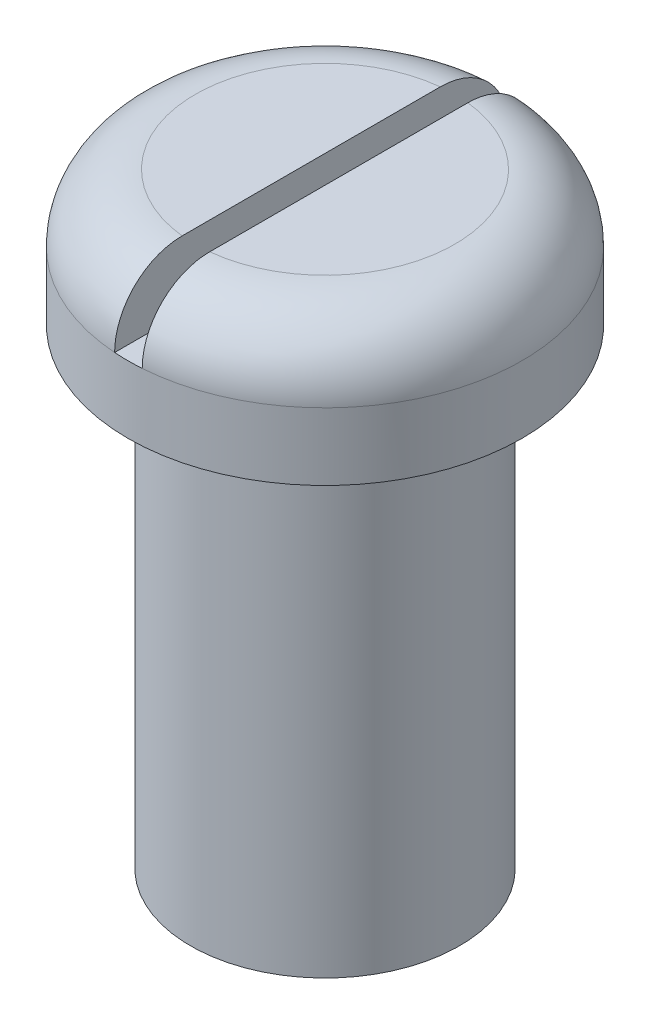
ISO-10303-21;
HEADER;
FILE_DESCRIPTION(('STEP AP214'),'2;1');
FILE_NAME('part.step','',(''),(''),'','','');
FILE_SCHEMA(('AUTOMOTIVE_DESIGN { 1 0 10303 214 1 1 1 1 }'));
ENDSEC;
DATA;
#1=APPLICATION_CONTEXT('core data for automotive mechanical design processes');
#2=APPLICATION_PROTOCOL_DEFINITION('international standard','automotive_design',2000,#1);
#3=PRODUCT_CONTEXT('',#1,'mechanical');
#4=PRODUCT('Part','Part','',(#3));
#5=PRODUCT_RELATED_PRODUCT_CATEGORY('part','',(#4));
#6=PRODUCT_DEFINITION_FORMATION('','',#4);
#7=PRODUCT_DEFINITION_CONTEXT('part definition',#1,'design');
#8=PRODUCT_DEFINITION('design','',#6,#7);
#9=PRODUCT_DEFINITION_SHAPE('','',#8);
#10=(LENGTH_UNIT() NAMED_UNIT(*) SI_UNIT(.MILLI.,.METRE.));
#11=(NAMED_UNIT(*) PLANE_ANGLE_UNIT() SI_UNIT($,.RADIAN.));
#12=(NAMED_UNIT(*) SI_UNIT($,.STERADIAN.) SOLID_ANGLE_UNIT());
#13=UNCERTAINTY_MEASURE_WITH_UNIT(LENGTH_MEASURE(1.E-05),#10,'distance_accuracy_value','');
#14=(GEOMETRIC_REPRESENTATION_CONTEXT(3) GLOBAL_UNCERTAINTY_ASSIGNED_CONTEXT((#13)) GLOBAL_UNIT_ASSIGNED_CONTEXT((#10,
#11,#12)) REPRESENTATION_CONTEXT('',''));
#15=CARTESIAN_POINT('',(0.,0.,0.));
#16=DIRECTION('',(0.,0.,1.));
#17=DIRECTION('',(1.,0.,0.));
#18=AXIS2_PLACEMENT_3D('',#15,#16,#17);
#19=CARTESIAN_POINT('',(0.,9.,0.));
#20=DIRECTION('',(0.,1.,0.));
#21=DIRECTION('',(0.,0.,1.));
#22=AXIS2_PLACEMENT_3D('',#19,#20,#21);
#23=PLANE('',#22);
#24=CARTESIAN_POINT('',(0.,9.,0.));
#25=DIRECTION('',(0.,-1.,0.));
#26=DIRECTION('',(0.,0.,-1.));
#27=AXIS2_PLACEMENT_3D('',#24,#25,#26);
#28=CIRCLE('',#27,1.92999999999999);
#29=CARTESIAN_POINT('',(-0.204999999999999,9.,1.91908181170058));
#30=VERTEX_POINT('',#29);
#31=CARTESIAN_POINT('',(-0.204999999999999,9.,-1.91908181170058));
#32=VERTEX_POINT('',#31);
#33=EDGE_CURVE('E39',#30,#32,#28,.T.);
#34=ORIENTED_EDGE('',*,*,#33,.F.);
#35=DIRECTION('',(0.,0.,-1.));
#36=VECTOR('',#35,1.);
#37=CARTESIAN_POINT('',(-0.205,9.,2.931));
#38=LINE('',#37,#36);
#39=EDGE_CURVE('E78',#30,#32,#38,.T.);
#40=ORIENTED_EDGE('',*,*,#39,.T.);
#41=EDGE_LOOP('',(#34,#40));
#42=FACE_BOUND('',#41,.T.);
#43=ADVANCED_FACE('F32',(#42),#23,.T.);
#44=CARTESIAN_POINT('',(0.205,9.,-1.91908181170058));
#45=VERTEX_POINT('',#44);
#46=CARTESIAN_POINT('',(0.205,9.,1.91908181170059));
#47=VERTEX_POINT('',#46);
#48=EDGE_CURVE('E11',#45,#47,#28,.T.);
#49=ORIENTED_EDGE('',*,*,#48,.F.);
#50=DIRECTION('',(0.,0.,-1.));
#51=VECTOR('',#50,1.);
#52=CARTESIAN_POINT('',(0.205,9.,2.931));
#53=LINE('',#52,#51);
#54=EDGE_CURVE('E71',#47,#45,#53,.T.);
#55=ORIENTED_EDGE('',*,*,#54,.F.);
#56=EDGE_LOOP('',(#49,#55));
#57=FACE_BOUND('',#56,.T.);
#58=ADVANCED_FACE('F87',(#57),#23,.T.);
#59=CARTESIAN_POINT('',(0.,8.,0.));
#60=DIRECTION('',(0.,-1.,0.));
#61=DIRECTION('',(0.,0.,-1.));
#62=AXIS2_PLACEMENT_3D('',#59,#60,#61);
#63=TOROIDAL_SURFACE('',#62,1.93,1.);
#64=ORIENTED_EDGE('',*,*,#33,.T.);
#65=CARTESIAN_POINT('',(-0.20500004878466,8.3634760546069,-2.85425123385193));
#66=CARTESIAN_POINT('',(-0.205000060924762,8.31128318651751,-2.8746646962673));
#67=CARTESIAN_POINT('',(-0.205000016333504,8.25732941608698,-2.89068735806144));
#68=CARTESIAN_POINT('',(-0.204999983647028,8.14745282198192,-2.91345918078132));
#69=CARTESIAN_POINT('',(-0.204999995619211,8.09152772805922,-2.92019726595171));
#70=CARTESIAN_POINT('',(-0.205000004378763,7.97936105584045,-2.92418234732537));
#71=CARTESIAN_POINT('',(-0.205000001173154,7.92311963587223,-2.92143373148673));
#72=CARTESIAN_POINT('',(-0.204999998827135,7.81191227055986,-2.90653250352774));
#73=CARTESIAN_POINT('',(-0.204999999685728,7.75694601500542,-2.89438220380387));
#74=CARTESIAN_POINT('',(-0.20500000031428,7.64983087903669,-2.8610290546288));
#75=CARTESIAN_POINT('',(-0.205000000084215,7.59768206140316,-2.83982600354943));
#76=CARTESIAN_POINT('',(-0.204999999915782,7.49767783227654,-2.78897299019701));
#77=CARTESIAN_POINT('',(-0.204999999977424,7.44982259431253,-2.75932268672232));
#78=CARTESIAN_POINT('',(-0.205000000022598,7.35971506283505,-2.69239090382436));
#79=CARTESIAN_POINT('',(-0.205000000006056,7.31746809567159,-2.65510225427839));
#80=CARTESIAN_POINT('',(-0.204999999993945,7.23981779166026,-2.57397549923543));
#81=CARTESIAN_POINT('',(-0.204999999998376,7.20441449430842,-2.53013735594272));
#82=CARTESIAN_POINT('',(-0.205000000001628,7.14136923430299,-2.43705599031676));
#83=CARTESIAN_POINT('',(-0.205000000000436,7.11374446137745,-2.38780112622582));
#84=CARTESIAN_POINT('',(-0.204999999999564,7.06712297739729,-2.28536544502652));
#85=CARTESIAN_POINT('',(-0.204999999999883,7.04812637452688,-2.23218457870175));
#86=CARTESIAN_POINT('',(-0.205000000000118,7.01922173894556,-2.12320237311493));
#87=CARTESIAN_POINT('',(-0.205000000000032,7.00934680607102,-2.06739225669441));
#88=CARTESIAN_POINT('',(-0.204999999999969,6.99905605766553,-1.9549073373052));
#89=CARTESIAN_POINT('',(-0.204999999999992,6.99864047933218,-1.8982325126892));
#90=CARTESIAN_POINT('',(-0.205000000000009,7.00727434091725,-1.78531782922262));
#91=CARTESIAN_POINT('',(-0.205000000000003,7.01637209590596,-1.72908166630521));
#92=CARTESIAN_POINT('',(-0.204999999999998,7.04382388108062,-1.61891607788622));
#93=CARTESIAN_POINT('',(-0.205,7.06217822900747,-1.56498673163714));
#94=CARTESIAN_POINT('',(-0.205000000000001,7.10774129768165,-1.46063501179173));
#95=CARTESIAN_POINT('',(-0.205,7.13500065613316,-1.41023474490182));
#96=CARTESIAN_POINT('',(-0.205,7.19756919850292,-1.31470339636545));
#97=CARTESIAN_POINT('',(-0.205,7.23287878720181,-1.26957257984942));
#98=CARTESIAN_POINT('',(-0.205,7.31068072616502,-1.18574457428164));
#99=CARTESIAN_POINT('',(-0.205,7.35319388874003,-1.14706669037335));
#100=CARTESIAN_POINT('',(-0.205,7.44415406950189,-1.07745796303861));
#101=CARTESIAN_POINT('',(-0.205,7.49260100047326,-1.04652700576694));
#102=CARTESIAN_POINT('',(-0.205,7.5936771862387,-0.993606139076374));
#103=CARTESIAN_POINT('',(-0.205,7.64627086708744,-0.971548363944125));
#104=CARTESIAN_POINT('',(-0.205,7.75446362392789,-0.936795829626461));
#105=CARTESIAN_POINT('',(-0.205,7.81006212094307,-0.924099273549402));
#106=CARTESIAN_POINT('',(-0.205,7.92141439857798,-0.908709769761603));
#107=CARTESIAN_POINT('',(-0.205,7.97713946523828,-0.905808824480563));
#108=CARTESIAN_POINT('',(-0.205,8.08826709999474,-0.909537083841432));
#109=CARTESIAN_POINT('',(-0.205,8.14366968948705,-0.916165648799566));
#110=CARTESIAN_POINT('',(-0.205,8.25187167456827,-0.938561454803291));
#111=CARTESIAN_POINT('',(-0.205,8.30469481883998,-0.954214449496018));
#112=CARTESIAN_POINT('',(-0.205,8.40702721272639,-0.994033810813302));
#113=CARTESIAN_POINT('',(-0.205000000000001,8.45653614272574,-1.01820099712382));
#114=CARTESIAN_POINT('',(-0.204999999999999,8.55165326705991,-1.07472094379417));
#115=CARTESIAN_POINT('',(-0.204999999999997,8.59719116185209,-1.10719194778067));
#116=CARTESIAN_POINT('',(-0.205000000000003,8.68231246645757,-1.1791744181796));
#117=CARTESIAN_POINT('',(-0.205000000000011,8.72189534975607,-1.21868650645853));
#118=CARTESIAN_POINT('',(-0.204999999999989,8.794801978765,-1.30452098569869));
#119=CARTESIAN_POINT('',(-0.204999999999958,8.82798183001994,-1.3509656886221));
#120=CARTESIAN_POINT('',(-0.205000000000042,8.88613662778988,-1.44873672974725));
#121=CARTESIAN_POINT('',(-0.205000000000157,8.91111119808982,-1.50006329164489));
#122=CARTESIAN_POINT('',(-0.204999999999842,8.95228301844873,-1.60652571950102));
#123=CARTESIAN_POINT('',(-0.204999999999409,8.96841987606833,-1.66168496230215));
#124=CARTESIAN_POINT('',(-0.205000000000591,8.99117135933444,-1.77393449500385));
#125=CARTESIAN_POINT('',(-0.205000000002206,8.99778604295973,-1.83102477314454));
#126=CARTESIAN_POINT('',(-0.204999999997801,9.00126926573594,-1.945318776725));
#127=CARTESIAN_POINT('',(-0.204999999991804,8.99816912511669,-2.00252154462081));
#128=CARTESIAN_POINT('',(-0.205000000008195,8.98235089581664,-2.11557974516592));
#129=CARTESIAN_POINT('',(-0.20500000003058,8.96963345620804,-2.17143526847836));
#130=CARTESIAN_POINT('',(-0.204999999969601,8.93502604303999,-2.27986369655133));
#131=CARTESIAN_POINT('',(-0.204999999886861,8.91319078823627,-2.33245406890842));
#132=CARTESIAN_POINT('',(-0.205000000113164,8.86095046859123,-2.4332093249281));
#133=CARTESIAN_POINT('',(-0.205000000422293,8.83054349765776,-2.48137322111299));
#134=CARTESIAN_POINT('',(-0.204999999579627,8.76218376196397,-2.57165676139258));
#135=CARTESIAN_POINT('',(-0.204999998434468,8.72426592968993,-2.61380288795137));
#136=CARTESIAN_POINT('',(-0.205000001563608,8.64189691479329,-2.6910612138556));
#137=CARTESIAN_POINT('',(-0.205000005831248,8.59745381823561,-2.72618199351115));
#138=CARTESIAN_POINT('',(-0.204999996363498,8.52106529235465,-2.77668507948159));
#139=CARTESIAN_POINT('',(-0.204999988799479,8.49071181628224,-2.79452129774276));
#140=CARTESIAN_POINT('',(-0.205000011200501,8.42829544218893,-2.82689857874814));
#141=CARTESIAN_POINT('',(-0.205000041165474,8.39623254732064,-2.84143964756918));
#142=CARTESIAN_POINT('',(-0.20500004878466,8.3634760546069,-2.85425123385193));
#143=B_SPLINE_CURVE_WITH_KNOTS('',3,(#65,#66,#67,#68,#69,#70,#71,#72,#73,#74,#75,#76,#77,#78,
#79,#80,#81,#82,#83,#84,#85,#86,#87,#88,#89,#90,#91,#92,#93,#94,#95,#96,#97,#98,#99,#100,#101,
#102,#103,#104,#105,#106,#107,#108,#109,#110,#111,#112,#113,#114,#115,#116,#117,#118,#119,#120,
#121,#122,#123,#124,#125,#126,#127,#128,#129,#130,#131,#132,#133,#134,#135,#136,#137,#138,#139,
#140,#141,#142),.UNSPECIFIED.,.T.,.F.,(4,2,2,2,2,2,2,2,2,2,2,2,2,2,2,2,2,2,2,2,2,2,2,2,2,2,2,2,
2,2,2,2,2,2,2,2,2,2,4),(0.,0.168000340627645,0.336200919191575,0.504323709053142,
0.672405161317299,0.840490357385161,1.00858234371774,1.17683284723471,1.34508432172621,
1.51370474742559,1.68232728731148,1.85155933194305,2.02079562014015,2.19089559725562,
2.36100141360378,2.53209187096179,2.70319093296614,2.87479303096284,3.04639260702708,
3.21665355668745,3.38688181614138,3.5534719615252,3.72005092479842,3.88456596413038,
4.04909684613314,4.21611549496796,4.3831489021581,4.55358417347577,4.72402725822127,
4.89562097635723,5.0672136496859,5.23825368446795,5.40928217677571,5.57929870040168,
5.74935306045781,5.9186343335324,6.08770757768463,6.19314558643731,6.29858340074268),.UNSPECIFIED.);
#144=CARTESIAN_POINT('',(-0.205,7.99999999999999,-2.922819700221));
#145=VERTEX_POINT('',#144);
#146=EDGE_CURVE('E85',#32,#145,#143,.T.);
#147=ORIENTED_EDGE('',*,*,#146,.T.);
#148=CARTESIAN_POINT('',(0.,7.99999999999999,0.));
#149=DIRECTION('',(0.,-1.,0.));
#150=DIRECTION('',(0.,0.,-1.));
#151=AXIS2_PLACEMENT_3D('',#148,#149,#150);
#152=CIRCLE('',#151,2.93);
#153=CARTESIAN_POINT('',(-0.205,8.,2.922819700221));
#154=VERTEX_POINT('',#153);
#155=EDGE_CURVE('E103',#154,#145,#152,.T.);
#156=ORIENTED_EDGE('',*,*,#155,.F.);
#157=CARTESIAN_POINT('',(-0.204999997842068,8.29561754475689,0.952891736788183));
#158=CARTESIAN_POINT('',(-0.204999996445594,8.35677852893359,0.972255530288602));
#159=CARTESIAN_POINT('',(-0.204999999050897,8.41613817482749,0.997630232839863));
#160=CARTESIAN_POINT('',(-0.205000000951151,8.52898049610866,1.05930834069386));
#161=CARTESIAN_POINT('',(-0.205000000238945,8.58245021096421,1.09563521477926));
#162=CARTESIAN_POINT('',(-0.20499999979105,8.67530430735198,1.17257736537412));
#163=CARTESIAN_POINT('',(-0.204999999944003,8.71561425513755,1.21208191998516));
#164=CARTESIAN_POINT('',(-0.205000000055948,8.78913125416652,1.29716742123168));
#165=CARTESIAN_POINT('',(-0.205000000015108,8.82234448683758,1.34274302317686));
#166=CARTESIAN_POINT('',(-0.204999999984635,8.88130745591155,1.43956023043828));
#167=CARTESIAN_POINT('',(-0.204999999995882,8.90692082688465,1.49088493249541));
#168=CARTESIAN_POINT('',(-0.205000000004118,8.94918277094845,1.59711339819894));
#169=CARTESIAN_POINT('',(-0.205000000001104,8.96582959630292,1.65201785726613));
#170=CARTESIAN_POINT('',(-0.204999999998895,8.98966567542061,1.76389558658108));
#171=CARTESIAN_POINT('',(-0.204999999999704,8.9968465143729,1.82087065133687));
#172=CARTESIAN_POINT('',(-0.205000000000296,9.00148800328759,1.93521494201559));
#173=CARTESIAN_POINT('',(-0.205000000000079,8.99894905108236,1.99258415171017));
#174=CARTESIAN_POINT('',(-0.204999999999921,8.98423388709374,2.10577429991539));
#175=CARTESIAN_POINT('',(-0.204999999999979,8.97210713213535,2.16160166639646));
#176=CARTESIAN_POINT('',(-0.205000000000021,8.9385993037619,2.27040666301053));
#177=CARTESIAN_POINT('',(-0.205000000000006,8.91721852867005,2.32338438494606));
#178=CARTESIAN_POINT('',(-0.204999999999994,8.86594326715926,2.42466947867025));
#179=CARTESIAN_POINT('',(-0.204999999999999,8.83609749633399,2.47300151447569));
#180=CARTESIAN_POINT('',(-0.205000000000002,8.76868200156866,2.56394007683404));
#181=CARTESIAN_POINT('',(-0.205,8.73111244031176,2.6065467239473));
#182=CARTESIAN_POINT('',(-0.205,8.64949374682002,2.68463276247478));
#183=CARTESIAN_POINT('',(-0.205,8.6054733295305,2.72014217040499));
#184=CARTESIAN_POINT('',(-0.205,8.51208182351105,2.78324166589638));
#185=CARTESIAN_POINT('',(-0.205,8.46271082908073,2.8108318929955));
#186=CARTESIAN_POINT('',(-0.205,8.36016991155681,2.85723212415346));
#187=CARTESIAN_POINT('',(-0.205,8.30701105022262,2.87606657629136));
#188=CARTESIAN_POINT('',(-0.205,8.19828323227095,2.90452860911121));
#189=CARTESIAN_POINT('',(-0.205,8.14271429783723,2.9141562745192));
#190=CARTESIAN_POINT('',(-0.205,8.03083229677896,2.92392073874421));
#191=CARTESIAN_POINT('',(-0.205,7.97452045923298,2.92407162587938));
#192=CARTESIAN_POINT('',(-0.205,7.86267148665753,2.91491381961978));
#193=CARTESIAN_POINT('',(-0.205,7.80713434848678,2.90560516459325));
#194=CARTESIAN_POINT('',(-0.205,7.69842959635712,2.87779984611974));
#195=CARTESIAN_POINT('',(-0.205,7.64526120993518,2.85930620220392));
#196=CARTESIAN_POINT('',(-0.205,7.54278056716571,2.81366192962983));
#197=CARTESIAN_POINT('',(-0.205,7.49346831609056,2.78651128913537));
#198=CARTESIAN_POINT('',(-0.205,7.40005579440777,2.72430448318342));
#199=CARTESIAN_POINT('',(-0.205,7.35595965331413,2.68924211714106));
#200=CARTESIAN_POINT('',(-0.205,7.27426559077917,2.61222529955743));
#201=CARTESIAN_POINT('',(-0.205,7.23666771196866,2.57027080280494));
#202=CARTESIAN_POINT('',(-0.205,7.16895342705447,2.48057425304301));
#203=CARTESIAN_POINT('',(-0.205,7.13885207099139,2.4328208393522));
#204=CARTESIAN_POINT('',(-0.205,7.08706323272511,2.33295163404732));
#205=CARTESIAN_POINT('',(-0.205,7.06537586608755,2.28083578252737));
#206=CARTESIAN_POINT('',(-0.205,7.03094698540261,2.17353417807489));
#207=CARTESIAN_POINT('',(-0.205,7.01823600692438,2.11833862907975));
#208=CARTESIAN_POINT('',(-0.205,7.00221259205253,2.00660062094997));
#209=CARTESIAN_POINT('',(-0.205,6.99890035257021,1.9500581336209));
#210=CARTESIAN_POINT('',(-0.205000000000001,7.00174683796789,1.83693564378556));
#211=CARTESIAN_POINT('',(-0.205000000000003,7.00795197282671,1.78035681084322));
#212=CARTESIAN_POINT('',(-0.204999999999998,7.02971623440125,1.6690280182914));
#213=CARTESIAN_POINT('',(-0.204999999999991,7.04527569099257,1.61427812325039));
#214=CARTESIAN_POINT('',(-0.20500000000001,7.08540700513018,1.50782321403321));
#215=CARTESIAN_POINT('',(-0.205000000000036,7.11003071469757,1.45613774509267));
#216=CARTESIAN_POINT('',(-0.204999999999964,7.16757325551713,1.35760876106778));
#217=CARTESIAN_POINT('',(-0.204999999999866,7.20049251889415,1.31076549839878));
#218=CARTESIAN_POINT('',(-0.205000000000135,7.27384714200899,1.22308009310032));
#219=CARTESIAN_POINT('',(-0.205000000000505,7.31431067875204,1.18226151094288));
#220=CARTESIAN_POINT('',(-0.204999999999496,7.40154781607031,1.1080388682383));
#221=CARTESIAN_POINT('',(-0.204999999998118,7.44832109925053,1.07463443496554));
#222=CARTESIAN_POINT('',(-0.205000000001872,7.54659398815668,1.01644497579933));
#223=CARTESIAN_POINT('',(-0.205000000006967,7.59806490281477,0.991611542386926));
#224=CARTESIAN_POINT('',(-0.204999999993032,7.70452306951789,0.951131868846659));
#225=CARTESIAN_POINT('',(-0.204999999973999,7.75951096745649,0.935487321659948));
#226=CARTESIAN_POINT('',(-0.205000000025497,7.87027415607582,0.914180068419065));
#227=CARTESIAN_POINT('',(-0.205000000094298,7.9260134870896,0.908329637928461));
#228=CARTESIAN_POINT('',(-0.204999999905873,8.03760270028993,0.906258829441404));
#229=CARTESIAN_POINT('',(-0.204999999649236,8.0934521996378,0.91002103611178));
#230=CARTESIAN_POINT('',(-0.205000000158727,8.17343125830506,0.922323220210235));
#231=CARTESIAN_POINT('',(-0.205000000441832,8.19818676168848,0.927119778370649));
#232=CARTESIAN_POINT('',(-0.204999999558084,8.24726017759327,0.938598355195038));
#233=CARTESIAN_POINT('',(-0.204999998390957,8.27157800649262,0.945280730178973));
#234=CARTESIAN_POINT('',(-0.204999997842068,8.29561754475689,0.952891736788183));
#235=B_SPLINE_CURVE_WITH_KNOTS('',3,(#157,#158,#159,#160,#161,#162,#163,#164,#165,#166,#167,
#168,#169,#170,#171,#172,#173,#174,#175,#176,#177,#178,#179,#180,#181,#182,#183,#184,#185,#186,
#187,#188,#189,#190,#191,#192,#193,#194,#195,#196,#197,#198,#199,#200,#201,#202,#203,#204,#205,
#206,#207,#208,#209,#210,#211,#212,#213,#214,#215,#216,#217,#218,#219,#220,#221,#222,#223,#224,
#225,#226,#227,#228,#229,#230,#231,#232,#233,#234),.UNSPECIFIED.,.T.,.F.,(4,2,2,2,2,2,2,2,2,2,2,
2,2,2,2,2,2,2,2,2,2,2,2,2,2,2,2,2,2,2,2,2,2,2,2,2,2,2,4),(0.,0.192337775799485,
0.385090666495362,0.553647749429158,0.722057410697961,0.893327828635857,1.06463161809771,
1.23608758600517,1.40753653627159,1.57810682517228,1.74867161578299,1.9182740674154,
2.0878729471441,2.25673860984776,2.42560129691381,2.59398960693861,2.76237636734447,
2.93051279557809,3.09864854184689,3.26672905066094,3.43480978928227,3.6030227166576,
3.77123674752528,3.9397858112826,4.1083371899696,4.27745921442113,4.44658478209202,
4.61653768986137,4.78649659128907,4.95744324641413,5.12839880818641,5.30000614684955,
5.47160485647856,5.64221790784243,5.81286238274567,5.98019699737217,6.1472286648636,
6.22281340773854,6.29841244171806),.UNSPECIFIED.);
#236=EDGE_CURVE('E121',#30,#154,#235,.T.);
#237=ORIENTED_EDGE('',*,*,#236,.F.);
#238=EDGE_LOOP('',(#64,#147,#156,#237));
#239=FACE_BOUND('',#238,.T.);
#240=ADVANCED_FACE('F89',(#239),#63,.T.);
#241=CARTESIAN_POINT('',(0.205,7.99999999999999,-2.922819700221));
#242=VERTEX_POINT('',#241);
#243=CARTESIAN_POINT('',(0.205,8.,2.922819700221));
#244=VERTEX_POINT('',#243);
#245=EDGE_CURVE('E84',#242,#244,#152,.T.);
#246=ORIENTED_EDGE('',*,*,#245,.F.);
#247=CARTESIAN_POINT('',(0.20500004878466,8.3634760546069,-2.85425123385193));
#248=CARTESIAN_POINT('',(0.205000061318218,8.41576907471558,-2.83379324139358));
#249=CARTESIAN_POINT('',(0.205000016439163,8.46637043498207,-2.80889741749494));
#250=CARTESIAN_POINT('',(0.204999983540744,8.5627128938599,-2.75093648212517));
#251=CARTESIAN_POINT('',(0.204999995590947,8.60844797627868,-2.71786142269876));
#252=CARTESIAN_POINT('',(0.205000004406523,8.69369501451799,-2.64452022944844));
#253=CARTESIAN_POINT('',(0.205000001180666,8.73321052731145,-2.60425823415986));
#254=CARTESIAN_POINT('',(0.204999998819628,8.80492430769794,-2.51769354392518));
#255=CARTESIAN_POINT('',(0.20499999968343,8.83712439148449,-2.47139235282693));
#256=CARTESIAN_POINT('',(0.205000000317188,8.89338220661632,-2.37396197277006));
#257=CARTESIAN_POINT('',(0.205000000085004,8.91742391108339,-2.32282353018406));
#258=CARTESIAN_POINT('',(0.204999999914992,8.95661876382134,-2.21724536480678));
#259=CARTESIAN_POINT('',(0.20499999997718,8.97177142197227,-2.16280546016366));
#260=CARTESIAN_POINT('',(0.205000000022909,8.99282556476752,-2.05194442508231));
#261=CARTESIAN_POINT('',(0.20500000000614,8.99869054163071,-1.99551636306919));
#262=CARTESIAN_POINT('',(0.20499999999386,9.0009173092682,-1.88247383692583));
#263=CARTESIAN_POINT('',(0.204999999998351,8.99727886742319,-1.82585936826673));
#264=CARTESIAN_POINT('',(0.205000000001658,8.9805837471835,-1.71372570694669));
#265=CARTESIAN_POINT('',(0.205000000000444,8.96747655549,-1.65821403618492));
#266=CARTESIAN_POINT('',(0.204999999999556,8.93218176537718,-1.55015657453813));
#267=CARTESIAN_POINT('',(0.204999999999881,8.90999384354191,-1.49761088936442));
#268=CARTESIAN_POINT('',(0.20500000000012,8.8570251639935,-1.39666677518227));
#269=CARTESIAN_POINT('',(0.205000000000032,8.82619681737059,-1.34829331222147));
#270=CARTESIAN_POINT('',(0.204999999999968,8.75686817015614,-1.25739337020799));
#271=CARTESIAN_POINT('',(0.204999999999991,8.71836747675605,-1.21486719071283));
#272=CARTESIAN_POINT('',(0.205000000000009,8.63470045263169,-1.13683744311598));
#273=CARTESIAN_POINT('',(0.205000000000002,8.58952468584451,-1.10134398570976));
#274=CARTESIAN_POINT('',(0.204999999999998,8.4938003721855,-1.0385401094772));
#275=CARTESIAN_POINT('',(0.204999999999999,8.44325211924023,-1.01122924329645));
#276=CARTESIAN_POINT('',(0.205000000000001,8.33879427001169,-0.965946286640973));
#277=CARTESIAN_POINT('',(0.205,8.28492815638989,-0.947874010401917));
#278=CARTESIAN_POINT('',(0.205,8.17489330667193,-0.921263554536119));
#279=CARTESIAN_POINT('',(0.205,8.1187250278578,-0.912723490937248));
#280=CARTESIAN_POINT('',(0.205,8.0070159883574,-0.905581435536414));
#281=CARTESIAN_POINT('',(0.205,7.95148898329802,-0.906763004099018));
#282=CARTESIAN_POINT('',(0.205,7.84143770377815,-0.918504314711166));
#283=CARTESIAN_POINT('',(0.205,7.78691341353233,-0.929063908997028));
#284=CARTESIAN_POINT('',(0.205,7.68076988352109,-0.95907541890569));
#285=CARTESIAN_POINT('',(0.205,7.62913371854489,-0.978467659740544));
#286=CARTESIAN_POINT('',(0.205,7.52975800638954,-1.02548531205921));
#287=CARTESIAN_POINT('',(0.205,7.48201885863568,-1.05311156614298));
#288=CARTESIAN_POINT('',(0.205,7.39082285605992,-1.11636172753454));
#289=CARTESIAN_POINT('',(0.205,7.34746405859214,-1.15212700105997));
#290=CARTESIAN_POINT('',(0.205,7.2672291693093,-1.2303101950645));
#291=CARTESIAN_POINT('',(0.205,7.23035360862018,-1.27272866005462));
#292=CARTESIAN_POINT('',(0.205,7.16346806503792,-1.36386535446776));
#293=CARTESIAN_POINT('',(0.205,7.13359430151047,-1.41268363830469));
#294=CARTESIAN_POINT('',(0.205,7.08242810879021,-1.51462844745966));
#295=CARTESIAN_POINT('',(0.205000000000001,7.06113595468187,-1.56775511081775));
#296=CARTESIAN_POINT('',(0.204999999999999,7.02768555868479,-1.67704064643905));
#297=CARTESIAN_POINT('',(0.204999999999997,7.01556345419339,-1.73321059007983));
#298=CARTESIAN_POINT('',(0.205000000000003,7.00096538399908,-1.84679099603705));
#299=CARTESIAN_POINT('',(0.205000000000012,6.99848926184711,-1.90420143821855));
#300=CARTESIAN_POINT('',(0.204999999999989,7.00327297637917,-2.01836939352448));
#301=CARTESIAN_POINT('',(0.204999999999958,7.0104911305643,-2.07512865047919));
#302=CARTESIAN_POINT('',(0.205000000000043,7.03441123132321,-2.18661290118748));
#303=CARTESIAN_POINT('',(0.205000000000159,7.05111291895353,-2.24133795044067));
#304=CARTESIAN_POINT('',(0.204999999999842,7.09341852718371,-2.34686253284968));
#305=CARTESIAN_POINT('',(0.204999999999412,7.11897024263176,-2.39768299679461));
#306=CARTESIAN_POINT('',(0.205000000000589,7.17828201736261,-2.49428458474737));
#307=CARTESIAN_POINT('',(0.205000000002196,7.21204188090463,-2.54006582888832));
#308=CARTESIAN_POINT('',(0.204999999997814,7.28663743758478,-2.62506380198628));
#309=CARTESIAN_POINT('',(0.204999999991861,7.32743915877012,-2.66431034779717));
#310=CARTESIAN_POINT('',(0.205000000008139,7.41506920354075,-2.73536806052859));
#311=CARTESIAN_POINT('',(0.20500000003037,7.46189717879108,-2.7671796569117));
#312=CARTESIAN_POINT('',(0.20499999996973,7.56008398703459,-2.82236051910325));
#313=CARTESIAN_POINT('',(0.204999999887204,7.61142740543665,-2.84575721788642));
#314=CARTESIAN_POINT('',(0.205000000112823,7.71733264920404,-2.88358636370557));
#315=CARTESIAN_POINT('',(0.205000000421061,7.77189524135079,-2.8980166655018));
#316=CARTESIAN_POINT('',(0.204999999579498,7.88259140091512,-2.91747754420292));
#317=CARTESIAN_POINT('',(0.204999998431633,7.93872278689414,-2.92252057280672));
#318=CARTESIAN_POINT('',(0.205000001566458,8.05098714149971,-2.92309229432809));
#319=CARTESIAN_POINT('',(0.205000005842541,8.10712002505254,-2.91863255955329));
#320=CARTESIAN_POINT('',(0.204999996371399,8.19679870645466,-2.90383652131936));
#321=CARTESIAN_POINT('',(0.204999988839817,8.23084333639131,-2.89636743049833));
#322=CARTESIAN_POINT('',(0.205000011160178,8.29796751788932,-2.87791819385943));
#323=CARTESIAN_POINT('',(0.205000041012101,8.33104706994532,-2.86693804984113));
#324=CARTESIAN_POINT('',(0.20500004878466,8.3634760546069,-2.85425123385193));
#325=B_SPLINE_CURVE_WITH_KNOTS('',3,(#247,#248,#249,#250,#251,#252,#253,#254,#255,#256,#257,
#258,#259,#260,#261,#262,#263,#264,#265,#266,#267,#268,#269,#270,#271,#272,#273,#274,#275,#276,
#277,#278,#279,#280,#281,#282,#283,#284,#285,#286,#287,#288,#289,#290,#291,#292,#293,#294,#295,
#296,#297,#298,#299,#300,#301,#302,#303,#304,#305,#306,#307,#308,#309,#310,#311,#312,#313,#314,
#315,#316,#317,#318,#319,#320,#321,#322,#323,#324),.UNSPECIFIED.,.T.,.F.,(4,2,2,2,2,2,2,2,2,2,2,
2,2,2,2,2,2,2,2,2,2,2,2,2,2,2,2,2,2,2,2,2,2,2,2,2,2,2,4),(0.,0.168329690912734,0.33686512767496,
0.505303826001415,0.673700660427088,0.842426415541847,1.01116147290166,1.18055815787464,
1.34995898928278,1.52027026697254,1.69058761093444,1.86186209681519,2.0331453538556,
2.20467309999638,2.37619146674897,2.54580813370508,2.71539127122788,2.88120924926447,
3.04702461465731,3.21173595167166,3.37646414965502,3.54430758092305,3.71216475602125,
3.88305751766294,4.05395575685604,4.22552401412147,4.39708948869416,4.56791963955568,
4.73874512620382,4.90857963054396,5.07841008521571,5.24744303053447,5.41646620964345,
5.58493326063207,5.7534406024085,5.92172426879694,6.08980311925921,6.19419111886642,
6.29857906497002),.UNSPECIFIED.);
#326=EDGE_CURVE('E46',#242,#45,#325,.T.);
#327=ORIENTED_EDGE('',*,*,#326,.T.);
#328=ORIENTED_EDGE('',*,*,#48,.T.);
#329=CARTESIAN_POINT('',(0.204999997842068,8.29561754475689,0.952891736788183));
#330=CARTESIAN_POINT('',(0.20499999660849,8.23438037104889,0.933513822587188));
#331=CARTESIAN_POINT('',(0.20499999909527,8.17114953113581,0.92010239361889));
#332=CARTESIAN_POINT('',(0.205000000906242,8.04320961959214,0.905956064752029));
#333=CARTESIAN_POINT('',(0.205000000225145,7.97849825496234,0.905242379055786));
#334=CARTESIAN_POINT('',(0.204999999807436,7.85951905171583,0.91572025227428));
#335=CARTESIAN_POINT('',(0.204999999948411,7.80509504858506,0.925203950671943));
#336=CARTESIAN_POINT('',(0.20500000005155,7.69863489843001,0.953118437812554));
#337=CARTESIAN_POINT('',(0.20500000001385,7.64659697429243,0.971542445476487));
#338=CARTESIAN_POINT('',(0.204999999986072,7.54599460272735,1.01684803187568));
#339=CARTESIAN_POINT('',(0.204999999996265,7.49745155549067,1.04377703892601));
#340=CARTESIAN_POINT('',(0.205000000003736,7.405433393919,1.10523591661284));
#341=CARTESIAN_POINT('',(0.205000000001011,7.36195949279019,1.13976760112129));
#342=CARTESIAN_POINT('',(0.204999999998967,7.28032758182635,1.21628185490979));
#343=CARTESIAN_POINT('',(0.204999999999723,7.24230723035648,1.25841135724898));
#344=CARTESIAN_POINT('',(0.205000000000277,7.17377758627689,1.34839084457353));
#345=CARTESIAN_POINT('',(0.205000000000075,7.1432686674097,1.39624111402828));
#346=CARTESIAN_POINT('',(0.204999999999925,7.09029313220055,1.49693075864175));
#347=CARTESIAN_POINT('',(0.20499999999998,7.06792563481601,1.54982233012069));
#348=CARTESIAN_POINT('',(0.205000000000021,7.0323950741504,1.65861248509989));
#349=CARTESIAN_POINT('',(0.205000000000006,7.01923204277787,1.71451107902368));
#350=CARTESIAN_POINT('',(0.204999999999995,7.00251816298482,1.82768363812874));
#351=CARTESIAN_POINT('',(0.204999999999999,6.99895971212374,1.88495647928119));
#352=CARTESIAN_POINT('',(0.205000000000002,7.00156514807092,1.99928137314126));
#353=CARTESIAN_POINT('',(0.205000000000001,7.00772882073856,2.05633343068414));
#354=CARTESIAN_POINT('',(0.205,7.02956793845384,2.1682603592267));
#355=CARTESIAN_POINT('',(0.205,7.04519071986493,2.22314550518718));
#356=CARTESIAN_POINT('',(0.205,7.08547957957168,2.32949004673644));
#357=CARTESIAN_POINT('',(0.205,7.11014538731423,2.38094954476079));
#358=CARTESIAN_POINT('',(0.205,7.16767122636961,2.4786850280625));
#359=CARTESIAN_POINT('',(0.205,7.20048579918069,2.52498777179004));
#360=CARTESIAN_POINT('',(0.205,7.27345196132955,2.61139806287954));
#361=CARTESIAN_POINT('',(0.205,7.31360338799622,2.6515057475606));
#362=CARTESIAN_POINT('',(0.205,7.39992654174932,2.72421941194528));
#363=CARTESIAN_POINT('',(0.205,7.44607333544228,2.75685499418521));
#364=CARTESIAN_POINT('',(0.205,7.54320220973732,2.81389225230802));
#365=CARTESIAN_POINT('',(0.205,7.59418421708401,2.83829405291042));
#366=CARTESIAN_POINT('',(0.205,7.69939589008775,2.87810968186076));
#367=CARTESIAN_POINT('',(0.205,7.7536169563426,2.89354623640361));
#368=CARTESIAN_POINT('',(0.205,7.86388241350664,2.91508448760335));
#369=CARTESIAN_POINT('',(0.205,7.91992678907703,2.92118626276941));
#370=CARTESIAN_POINT('',(0.205,8.03217248762974,2.92387802727864));
#371=CARTESIAN_POINT('',(0.205,8.08837352366528,2.92047999869454));
#372=CARTESIAN_POINT('',(0.205,8.19940687437079,2.90429540838346));
#373=CARTESIAN_POINT('',(0.205,8.2542391933273,2.89150887606305));
#374=CARTESIAN_POINT('',(0.205,8.36097293786182,2.8569158716361));
#375=CARTESIAN_POINT('',(0.205,8.41287471812372,2.83511049375383));
#376=CARTESIAN_POINT('',(0.205,8.51228569161345,2.78310397912718));
#377=CARTESIAN_POINT('',(0.205,8.5597948722003,2.7529028182225));
#378=CARTESIAN_POINT('',(0.205,8.64912560773476,2.68493319268119));
#379=CARTESIAN_POINT('',(0.205,8.69094141922286,2.64715718013524));
#380=CARTESIAN_POINT('',(0.205,8.767654238183,2.56513509005156));
#381=CARTESIAN_POINT('',(0.204999999999999,8.80255120243786,2.52088897210263));
#382=CARTESIAN_POINT('',(0.205000000000001,8.86452345496291,2.42707960563114));
#383=CARTESIAN_POINT('',(0.205000000000002,8.89158108051268,2.37750468987711));
#384=CARTESIAN_POINT('',(0.204999999999998,8.93702334613511,2.27452822655289));
#385=CARTESIAN_POINT('',(0.204999999999991,8.9554078357901,2.22112661263501));
#386=CARTESIAN_POINT('',(0.205000000000009,8.98305913349374,2.11180501323355));
#387=CARTESIAN_POINT('',(0.205000000000033,8.99229229479203,2.05587651901323));
#388=CARTESIAN_POINT('',(0.204999999999967,9.00128923096724,1.94326355603631));
#389=CARTESIAN_POINT('',(0.204999999999879,9.00105274531677,1.88657906652378));
#390=CARTESIAN_POINT('',(0.205000000000122,8.99111912943806,1.77374970511416));
#391=CARTESIAN_POINT('',(0.205000000000457,8.98137301808782,1.71760914719289));
#392=CARTESIAN_POINT('',(0.204999999999543,8.95264989803342,1.6077449238858));
#393=CARTESIAN_POINT('',(0.204999999998295,8.93367311923889,1.55402119834));
#394=CARTESIAN_POINT('',(0.205000000001715,8.88690890847994,1.45019259555536));
#395=CARTESIAN_POINT('',(0.205000000006416,8.85907263841197,1.40010971457514));
#396=CARTESIAN_POINT('',(0.204999999993581,8.7953969514226,1.30528634453122));
#397=CARTESIAN_POINT('',(0.204999999976035,8.75955408682893,1.26054816969537));
#398=CARTESIAN_POINT('',(0.205000000024048,8.68074054829699,1.17757654575473));
#399=CARTESIAN_POINT('',(0.205000000089896,8.63774563540171,1.13936614436618));
#400=CARTESIAN_POINT('',(0.204999999910272,8.545955647794,1.07083191886978));
#401=CARTESIAN_POINT('',(0.204999999665382,8.49717157005271,1.04049348006515));
#402=CARTESIAN_POINT('',(0.20500000015892,8.42200344584461,1.00225366025974));
#403=CARTESIAN_POINT('',(0.205000000448554,8.3973075061728,0.990935513550225));
#404=CARTESIAN_POINT('',(0.204999999551286,8.34706599433709,0.970352494650316));
#405=CARTESIAN_POINT('',(0.204999998363856,8.32152012160138,0.961088357913623));
#406=CARTESIAN_POINT('',(0.204999997842068,8.29561754475689,0.952891736788183));
#407=B_SPLINE_CURVE_WITH_KNOTS('',3,(#329,#330,#331,#332,#333,#334,#335,#336,#337,#338,#339,
#340,#341,#342,#343,#344,#345,#346,#347,#348,#349,#350,#351,#352,#353,#354,#355,#356,#357,#358,
#359,#360,#361,#362,#363,#364,#365,#366,#367,#368,#369,#370,#371,#372,#373,#374,#375,#376,#377,
#378,#379,#380,#381,#382,#383,#384,#385,#386,#387,#388,#389,#390,#391,#392,#393,#394,#395,#396,
#397,#398,#399,#400,#401,#402,#403,#404,#405,#406),.UNSPECIFIED.,.T.,.F.,(4,2,2,2,2,2,2,2,2,2,2,
2,2,2,2,2,2,2,2,2,2,2,2,2,2,2,2,2,2,2,2,2,2,2,2,2,2,2,4),(0.,0.192554666167931,
0.385431004516878,0.550396243386524,0.715236553923133,0.881012831954021,1.04682870438102,
1.216284894311,1.38574951408328,1.55721326953408,1.72867761938433,1.9000062079345,
2.07133102283389,2.24171064618998,2.41208517247186,2.58152980181779,2.75097067473049,
2.91972818044132,3.08848312981759,3.25680841019013,3.42513227487303,3.59324392901047,
3.7613550565926,3.92944579383358,4.09753701478941,4.2657965689477,4.43405717407213,
4.60269398836906,4.77133372721655,4.94059123001718,5.10985338940607,5.27999199264014,
5.45012635842342,5.62121532796133,5.79237811161054,5.96413326361486,6.13556722427539,
6.21698639136519,6.29843466428783),.UNSPECIFIED.);
#408=EDGE_CURVE('E74',#244,#47,#407,.T.);
#409=ORIENTED_EDGE('',*,*,#408,.F.);
#410=EDGE_LOOP('',(#246,#327,#328,#409));
#411=FACE_BOUND('',#410,.T.);
#412=ADVANCED_FACE('F82',(#411),#63,.T.);
#413=CARTESIAN_POINT('',(0.,0.,0.));
#414=DIRECTION('',(0.,-1.,0.));
#415=DIRECTION('',(0.,0.,-1.));
#416=AXIS2_PLACEMENT_3D('',#413,#414,#415);
#417=CYLINDRICAL_SURFACE('',#416,2.93);
#418=ORIENTED_EDGE('',*,*,#245,.T.);
#419=CARTESIAN_POINT('',(0.,7.99999999999999,0.));
#420=DIRECTION('',(0.,-1.,0.));
#421=DIRECTION('',(0.,0.,-1.));
#422=AXIS2_PLACEMENT_3D('',#419,#420,#421);
#423=CIRCLE('',#422,2.93);
#424=EDGE_CURVE('E151',#244,#154,#423,.T.);
#425=ORIENTED_EDGE('',*,*,#424,.T.);
#426=ORIENTED_EDGE('',*,*,#155,.T.);
#427=CARTESIAN_POINT('',(0.,8.,0.));
#428=DIRECTION('',(0.,-1.,0.));
#429=DIRECTION('',(0.,0.,-1.));
#430=AXIS2_PLACEMENT_3D('',#427,#428,#429);
#431=CIRCLE('',#430,2.93);
#432=EDGE_CURVE('E152',#145,#242,#431,.T.);
#433=ORIENTED_EDGE('',*,*,#432,.T.);
#434=EDGE_LOOP('',(#418,#425,#426,#433));
#435=FACE_BOUND('',#434,.T.);
#436=CARTESIAN_POINT('',(0.,7.,0.));
#437=DIRECTION('',(0.,-1.,0.));
#438=DIRECTION('',(0.,0.,-1.));
#439=AXIS2_PLACEMENT_3D('',#436,#437,#438);
#440=CIRCLE('',#439,2.93);
#441=CARTESIAN_POINT('',(0.,7.,-2.93));
#442=VERTEX_POINT('',#441);
#443=EDGE_CURVE('E108',#442,#442,#440,.T.);
#444=ORIENTED_EDGE('',*,*,#443,.F.);
#445=EDGE_LOOP('',(#444));
#446=FACE_BOUND('',#445,.T.);
#447=ADVANCED_FACE('F166',(#435,#446),#417,.T.);
#448=CARTESIAN_POINT('',(2.93,7.,0.));
#449=DIRECTION('',(0.,-1.,0.));
#450=DIRECTION('',(0.,0.,-1.));
#451=AXIS2_PLACEMENT_3D('',#448,#449,#450);
#452=PLANE('',#451);
#453=ORIENTED_EDGE('',*,*,#443,.T.);
#454=EDGE_LOOP('',(#453));
#455=FACE_BOUND('',#454,.T.);
#456=CARTESIAN_POINT('',(0.,7.,0.));
#457=DIRECTION('',(0.,-1.,0.));
#458=DIRECTION('',(0.,0.,-1.));
#459=AXIS2_PLACEMENT_3D('',#456,#457,#458);
#460=CIRCLE('',#459,2.);
#461=CARTESIAN_POINT('',(0.,7.,-2.));
#462=VERTEX_POINT('',#461);
#463=EDGE_CURVE('E112',#462,#462,#460,.T.);
#464=ORIENTED_EDGE('',*,*,#463,.F.);
#465=EDGE_LOOP('',(#464));
#466=FACE_BOUND('',#465,.T.);
#467=ADVANCED_FACE('F169',(#455,#466),#452,.T.);
#468=CARTESIAN_POINT('',(0.,0.,0.));
#469=DIRECTION('',(0.,-1.,0.));
#470=DIRECTION('',(0.,0.,-1.));
#471=AXIS2_PLACEMENT_3D('',#468,#469,#470);
#472=CYLINDRICAL_SURFACE('',#471,2.);
#473=ORIENTED_EDGE('',*,*,#463,.T.);
#474=EDGE_LOOP('',(#473));
#475=FACE_BOUND('',#474,.T.);
#476=CARTESIAN_POINT('',(0.,0.,0.));
#477=DIRECTION('',(0.,-1.,0.));
#478=DIRECTION('',(0.,0.,-1.));
#479=AXIS2_PLACEMENT_3D('',#476,#477,#478);
#480=CIRCLE('',#479,2.);
#481=CARTESIAN_POINT('',(0.,0.,-2.));
#482=VERTEX_POINT('',#481);
#483=EDGE_CURVE('E115',#482,#482,#480,.T.);
#484=ORIENTED_EDGE('',*,*,#483,.F.);
#485=EDGE_LOOP('',(#484));
#486=FACE_BOUND('',#485,.T.);
#487=ADVANCED_FACE('F175',(#475,#486),#472,.T.);
#488=CARTESIAN_POINT('',(2.,0.,0.));
#489=DIRECTION('',(0.,-1.,0.));
#490=DIRECTION('',(0.,0.,-1.));
#491=AXIS2_PLACEMENT_3D('',#488,#489,#490);
#492=PLANE('',#491);
#493=ORIENTED_EDGE('',*,*,#483,.T.);
#494=EDGE_LOOP('',(#493));
#495=FACE_BOUND('',#494,.T.);
#496=ADVANCED_FACE('F149',(#495),#492,.T.);
#497=CARTESIAN_POINT('',(-0.205,9.,2.931));
#498=DIRECTION('',(1.,0.,0.));
#499=DIRECTION('',(0.,1.,0.));
#500=AXIS2_PLACEMENT_3D('',#497,#498,#499);
#501=PLANE('',#500);
#502=ORIENTED_EDGE('',*,*,#236,.T.);
#503=DIRECTION('',(0.,0.,-1.));
#504=VECTOR('',#503,1.);
#505=CARTESIAN_POINT('',(-0.205,8.,2.931));
#506=LINE('',#505,#504);
#507=EDGE_CURVE('E54',#154,#145,#506,.T.);
#508=ORIENTED_EDGE('',*,*,#507,.T.);
#509=ORIENTED_EDGE('',*,*,#146,.F.);
#510=ORIENTED_EDGE('',*,*,#39,.F.);
#511=EDGE_LOOP('',(#502,#508,#509,#510));
#512=FACE_BOUND('',#511,.T.);
#513=ADVANCED_FACE('F133',(#512),#501,.T.);
#514=CARTESIAN_POINT('',(-0.205,8.,2.931));
#515=DIRECTION('',(0.,1.,0.));
#516=DIRECTION('',(0.,0.,1.));
#517=AXIS2_PLACEMENT_3D('',#514,#515,#516);
#518=PLANE('',#517);
#519=ORIENTED_EDGE('',*,*,#424,.F.);
#520=DIRECTION('',(0.,0.,-1.));
#521=VECTOR('',#520,1.);
#522=CARTESIAN_POINT('',(0.205,8.,2.931));
#523=LINE('',#522,#521);
#524=EDGE_CURVE('E77',#244,#242,#523,.T.);
#525=ORIENTED_EDGE('',*,*,#524,.T.);
#526=ORIENTED_EDGE('',*,*,#432,.F.);
#527=ORIENTED_EDGE('',*,*,#507,.F.);
#528=EDGE_LOOP('',(#519,#525,#526,#527));
#529=FACE_BOUND('',#528,.T.);
#530=ADVANCED_FACE('F144',(#529),#518,.T.);
#531=CARTESIAN_POINT('',(0.205,9.,2.931));
#532=DIRECTION('',(-1.,0.,0.));
#533=DIRECTION('',(0.,-1.,0.));
#534=AXIS2_PLACEMENT_3D('',#531,#532,#533);
#535=PLANE('',#534);
#536=ORIENTED_EDGE('',*,*,#408,.T.);
#537=ORIENTED_EDGE('',*,*,#54,.T.);
#538=ORIENTED_EDGE('',*,*,#326,.F.);
#539=ORIENTED_EDGE('',*,*,#524,.F.);
#540=EDGE_LOOP('',(#536,#537,#538,#539));
#541=FACE_BOUND('',#540,.T.);
#542=ADVANCED_FACE('F72',(#541),#535,.T.);
#543=CLOSED_SHELL('',(#43,#58,#240,#412,#447,#467,#487,#496,#513,#530,#542));
#544=MANIFOLD_SOLID_BREP('B2',#543);
#545=ADVANCED_BREP_SHAPE_REPRESENTATION('',(#18,#544),#14);
#546=SHAPE_DEFINITION_REPRESENTATION(#9,#545);
ENDSEC;
END-ISO-10303-21;
